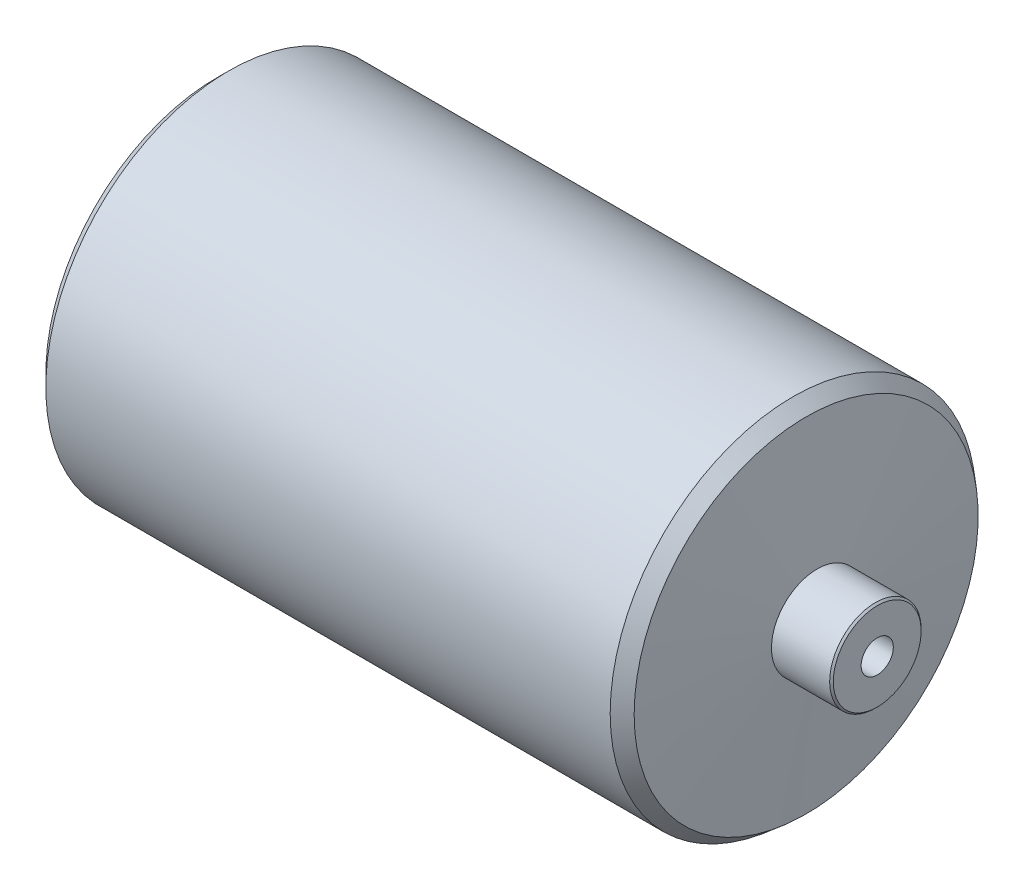
ISO-10303-21;
HEADER;
FILE_DESCRIPTION(('STEP AP214'),'2;1');
FILE_NAME('part.step','',(''),(''),'','','');
FILE_SCHEMA(('AUTOMOTIVE_DESIGN { 1 0 10303 214 1 1 1 1 }'));
ENDSEC;
DATA;
#1=APPLICATION_CONTEXT('core data for automotive mechanical design processes');
#2=APPLICATION_PROTOCOL_DEFINITION('international standard','automotive_design',2000,#1);
#3=PRODUCT_CONTEXT('',#1,'mechanical');
#4=PRODUCT('Part','Part','',(#3));
#5=PRODUCT_RELATED_PRODUCT_CATEGORY('part','',(#4));
#6=PRODUCT_DEFINITION_FORMATION('','',#4);
#7=PRODUCT_DEFINITION_CONTEXT('part definition',#1,'design');
#8=PRODUCT_DEFINITION('design','',#6,#7);
#9=PRODUCT_DEFINITION_SHAPE('','',#8);
#10=(LENGTH_UNIT() NAMED_UNIT(*) SI_UNIT(.MILLI.,.METRE.));
#11=(NAMED_UNIT(*) PLANE_ANGLE_UNIT() SI_UNIT($,.RADIAN.));
#12=(NAMED_UNIT(*) SI_UNIT($,.STERADIAN.) SOLID_ANGLE_UNIT());
#13=UNCERTAINTY_MEASURE_WITH_UNIT(LENGTH_MEASURE(1.E-05),#10,'distance_accuracy_value','');
#14=(GEOMETRIC_REPRESENTATION_CONTEXT(3) GLOBAL_UNCERTAINTY_ASSIGNED_CONTEXT((#13)) GLOBAL_UNIT_ASSIGNED_CONTEXT((#10,
#11,#12)) REPRESENTATION_CONTEXT('',''));
#15=CARTESIAN_POINT('',(0.,0.,0.));
#16=DIRECTION('',(0.,0.,1.));
#17=DIRECTION('',(1.,0.,0.));
#18=AXIS2_PLACEMENT_3D('',#15,#16,#17);
#19=CARTESIAN_POINT('',(200.,0.,0.));
#20=DIRECTION('',(-1.,0.,0.));
#21=DIRECTION('',(0.,0.,1.));
#22=AXIS2_PLACEMENT_3D('',#19,#20,#21);
#23=PLANE('',#22);
#24=CARTESIAN_POINT('',(200.,0.,0.));
#25=DIRECTION('',(1.,0.,0.));
#26=DIRECTION('',(0.,0.,-1.));
#27=AXIS2_PLACEMENT_3D('',#24,#25,#26);
#28=CIRCLE('',#27,4.4);
#29=CARTESIAN_POINT('',(200.,0.,-4.4));
#30=VERTEX_POINT('',#29);
#31=EDGE_CURVE('E63',#30,#30,#28,.T.);
#32=ORIENTED_EDGE('',*,*,#31,.F.);
#33=EDGE_LOOP('',(#32));
#34=FACE_BOUND('',#33,.T.);
#35=CARTESIAN_POINT('',(200.,0.,0.));
#36=DIRECTION('',(-1.,0.,0.));
#37=DIRECTION('',(0.,0.,1.));
#38=AXIS2_PLACEMENT_3D('',#35,#36,#37);
#39=CIRCLE('',#38,12.);
#40=CARTESIAN_POINT('',(200.,0.,12.));
#41=VERTEX_POINT('',#40);
#42=EDGE_CURVE('E83',#41,#41,#39,.F.);
#43=ORIENTED_EDGE('',*,*,#42,.T.);
#44=EDGE_LOOP('',(#43));
#45=FACE_BOUND('',#44,.T.);
#46=ADVANCED_FACE('F39',(#34,#45),#23,.F.);
#47=CARTESIAN_POINT('',(16.5,0.,0.));
#48=DIRECTION('',(-1.,0.,0.));
#49=DIRECTION('',(0.,0.,1.));
#50=AXIS2_PLACEMENT_3D('',#47,#48,#49);
#51=CYLINDRICAL_SURFACE('',#50,12.5);
#52=CARTESIAN_POINT('',(199.5,0.,0.));
#53=DIRECTION('',(-1.,0.,0.));
#54=DIRECTION('',(0.,0.,1.));
#55=AXIS2_PLACEMENT_3D('',#52,#53,#54);
#56=CIRCLE('',#55,12.5);
#57=CARTESIAN_POINT('',(199.5,0.,12.5));
#58=VERTEX_POINT('',#57);
#59=EDGE_CURVE('E80',#58,#58,#56,.T.);
#60=ORIENTED_EDGE('',*,*,#59,.T.);
#61=EDGE_LOOP('',(#60));
#62=FACE_BOUND('',#61,.T.);
#63=CARTESIAN_POINT('',(183.6,0.,0.));
#64=DIRECTION('',(1.,0.,0.));
#65=DIRECTION('',(0.,0.,-1.));
#66=AXIS2_PLACEMENT_3D('',#63,#64,#65);
#67=CIRCLE('',#66,12.5);
#68=CARTESIAN_POINT('',(183.6,0.,12.5000000000002));
#69=VERTEX_POINT('',#68);
#70=EDGE_CURVE('E74',#69,#69,#67,.T.);
#71=ORIENTED_EDGE('',*,*,#70,.T.);
#72=EDGE_LOOP('',(#71));
#73=FACE_BOUND('',#72,.T.);
#74=ADVANCED_FACE('F141',(#62,#73),#51,.T.);
#75=CARTESIAN_POINT('',(183.6,0.,0.));
#76=DIRECTION('',(-1.,0.,0.));
#77=DIRECTION('',(0.,0.,1.));
#78=AXIS2_PLACEMENT_3D('',#75,#76,#77);
#79=CONICAL_SURFACE('',#78,12.5,1.48352986419518);
#80=CARTESIAN_POINT('',(180.580642346021,0.,0.));
#81=DIRECTION('',(1.,0.,0.));
#82=DIRECTION('',(0.,0.,-1.));
#83=AXIS2_PLACEMENT_3D('',#80,#81,#82);
#84=CIRCLE('',#83,47.0114159057248);
#85=CARTESIAN_POINT('',(180.580642346021,0.,47.011415905725));
#86=VERTEX_POINT('',#85);
#87=EDGE_CURVE('E47',#86,#86,#84,.T.);
#88=CARTESIAN_POINT('',(180.580642346021,0.,47.011415905725));
#89=CARTESIAN_POINT('',(180.61209398825,0.,46.6519219900404));
#90=CARTESIAN_POINT('',(180.643545630479,0.,46.2924280743557));
#91=CARTESIAN_POINT('',(180.706448914937,0.,45.5734402429865));
#92=CARTESIAN_POINT('',(180.737900557166,0.,45.2139463273018));
#93=CARTESIAN_POINT('',(180.800803841624,0.,44.4949584959326));
#94=CARTESIAN_POINT('',(180.832255483853,0.,44.1354645802479));
#95=CARTESIAN_POINT('',(180.89515876831,0.,43.4164767488787));
#96=CARTESIAN_POINT('',(180.926610410539,0.,43.056982833194));
#97=CARTESIAN_POINT('',(180.989513694997,0.,42.3379950018248));
#98=CARTESIAN_POINT('',(181.020965337226,0.,41.9785010861401));
#99=CARTESIAN_POINT('',(181.083868621684,0.,41.2595132547709));
#100=CARTESIAN_POINT('',(181.115320263913,0.,40.9000193390862));
#101=CARTESIAN_POINT('',(181.178223548371,0.,40.181031507717));
#102=CARTESIAN_POINT('',(181.2096751906,0.,39.8215375920323));
#103=CARTESIAN_POINT('',(181.272578475058,0.,39.1025497606631));
#104=CARTESIAN_POINT('',(181.304030117287,0.,38.7430558449784));
#105=CARTESIAN_POINT('',(181.366933401745,0.,38.0240680136092));
#106=CARTESIAN_POINT('',(181.398385043974,0.,37.6645740979245));
#107=CARTESIAN_POINT('',(181.461288328432,0.,36.9455862665553));
#108=CARTESIAN_POINT('',(181.49273997066,0.,36.5860923508706));
#109=CARTESIAN_POINT('',(181.555643255118,0.,35.8671045195014));
#110=CARTESIAN_POINT('',(181.587094897347,0.,35.5076106038167));
#111=CARTESIAN_POINT('',(181.649998181805,0.,34.7886227724475));
#112=CARTESIAN_POINT('',(181.681449824034,0.,34.4291288567628));
#113=CARTESIAN_POINT('',(181.744353108492,0.,33.7101410253936));
#114=CARTESIAN_POINT('',(181.775804750721,0.,33.3506471097089));
#115=CARTESIAN_POINT('',(181.838708035179,0.,32.6316592783397));
#116=CARTESIAN_POINT('',(181.870159677408,0.,32.272165362655));
#117=CARTESIAN_POINT('',(181.933062961866,0.,31.5531775312857));
#118=CARTESIAN_POINT('',(181.964514604095,0.,31.1936836156011));
#119=CARTESIAN_POINT('',(182.027417888553,0.,30.4746957842318));
#120=CARTESIAN_POINT('',(182.058869530782,0.,30.1152018685472));
#121=CARTESIAN_POINT('',(182.121772815239,0.,29.3962140371779));
#122=CARTESIAN_POINT('',(182.153224457468,0.,29.0367201214933));
#123=CARTESIAN_POINT('',(182.216127741926,0.,28.317732290124));
#124=CARTESIAN_POINT('',(182.247579384155,0.,27.9582383744394));
#125=CARTESIAN_POINT('',(182.310482668613,0.,27.2392505430701));
#126=CARTESIAN_POINT('',(182.341934310842,0.,26.8797566273855));
#127=CARTESIAN_POINT('',(182.4048375953,0.,26.1607687960162));
#128=CARTESIAN_POINT('',(182.436289237529,0.,25.8012748803316));
#129=CARTESIAN_POINT('',(182.499192521987,0.,25.0822870489623));
#130=CARTESIAN_POINT('',(182.530644164216,0.,24.7227931332777));
#131=CARTESIAN_POINT('',(182.593547448674,0.,24.0038053019084));
#132=CARTESIAN_POINT('',(182.624999090903,0.,23.6443113862238));
#133=CARTESIAN_POINT('',(182.687902375361,0.,22.9253235548545));
#134=CARTESIAN_POINT('',(182.719354017589,0.,22.5658296391699));
#135=CARTESIAN_POINT('',(182.782257302047,0.,21.8468418078006));
#136=CARTESIAN_POINT('',(182.813708944276,0.,21.487347892116));
#137=CARTESIAN_POINT('',(182.876612228734,0.,20.7683600607467));
#138=CARTESIAN_POINT('',(182.908063870963,0.,20.4088661450621));
#139=CARTESIAN_POINT('',(182.970967155421,0.,19.6898783136928));
#140=CARTESIAN_POINT('',(183.00241879765,0.,19.3303843980082));
#141=CARTESIAN_POINT('',(183.065322082108,0.,18.6113965666389));
#142=CARTESIAN_POINT('',(183.096773724337,0.,18.2519026509543));
#143=CARTESIAN_POINT('',(183.159677008795,0.,17.532914819585));
#144=CARTESIAN_POINT('',(183.191128651024,0.,17.1734209039004));
#145=CARTESIAN_POINT('',(183.254031935482,0.,16.4544330725311));
#146=CARTESIAN_POINT('',(183.285483577711,0.,16.0949391568465));
#147=CARTESIAN_POINT('',(183.348386862168,0.,15.3759513254772));
#148=CARTESIAN_POINT('',(183.379838504397,0.,15.0164574097926));
#149=CARTESIAN_POINT('',(183.442741788855,0.,14.2974695784233));
#150=CARTESIAN_POINT('',(183.474193431084,0.,13.9379756627387));
#151=CARTESIAN_POINT('',(183.537096715542,0.,13.2189878313694));
#152=CARTESIAN_POINT('',(183.568548357771,0.,12.8594939156848));
#153=CARTESIAN_POINT('',(183.6,0.,12.5000000000002));
#154=B_SPLINE_CURVE_WITH_KNOTS('',3,(#88,#89,#90,#91,#92,#93,#94,#95,#96,#97,#98,#99,#100,#101,
#102,#103,#104,#105,#106,#107,#108,#109,#110,#111,#112,#113,#114,#115,#116,#117,#118,#119,#120,
#121,#122,#123,#124,#125,#126,#127,#128,#129,#130,#131,#132,#133,#134,#135,#136,#137,#138,#139,
#140,#141,#142,#143,#144,#145,#146,#147,#148,#149,#150,#151,#152,#153),.UNSPECIFIED.,.F.,.F.,(4,
2,2,2,2,2,2,2,2,2,2,2,2,2,2,2,2,2,2,2,2,2,2,2,2,2,2,2,2,2,2,2,4),(0.,1.08260137212112,
2.16520274424223,3.24780411636334,4.33040548848446,5.41300686060557,6.49560823272668,
7.57820960484779,8.66081097696891,9.74341234909002,10.8260137212111,11.9086150933322,
12.9912164654534,14.0738178375745,15.1564192096956,16.2390205818167,17.3216219539378,
18.4042233260589,19.48682469818,20.5694260703011,21.6520274424223,22.7346288145434,
23.8172301866645,24.8998315587856,25.9824329309067,27.0650343030278,28.1476356751489,
29.2302370472701,30.3128384193912,31.3954397915123,32.4780411636334,33.5606425357545,
34.6432439078756),.UNSPECIFIED.);
#155=EDGE_CURVE('BSEAM100',#86,#69,#154,.T.);
#156=ORIENTED_EDGE('',*,*,#87,.T.);
#157=ORIENTED_EDGE('',*,*,#70,.F.);
#158=ORIENTED_EDGE('',*,*,#155,.T.);
#159=ORIENTED_EDGE('',*,*,#155,.F.);
#160=EDGE_LOOP('',(#156,#158,#157,#159));
#161=FACE_BOUND('',#160,.T.);
#162=ADVANCED_FACE('F100',(#161),#79,.T.);
#163=CARTESIAN_POINT('',(16.5,0.,0.));
#164=DIRECTION('',(-1.,0.,0.));
#165=DIRECTION('',(0.,0.,1.));
#166=AXIS2_PLACEMENT_3D('',#163,#164,#165);
#167=CYLINDRICAL_SURFACE('',#166,50.);
#168=CARTESIAN_POINT('',(177.018986514899,0.,0.));
#169=DIRECTION('',(1.,0.,0.));
#170=DIRECTION('',(0.,0.,-1.));
#171=AXIS2_PLACEMENT_3D('',#168,#169,#170);
#172=CIRCLE('',#171,50.);
#173=CARTESIAN_POINT('',(177.018986514899,0.,-50.));
#174=VERTEX_POINT('',#173);
#175=EDGE_CURVE('E95',#174,#174,#172,.F.);
#176=ORIENTED_EDGE('',*,*,#175,.T.);
#177=EDGE_LOOP('',(#176));
#178=FACE_BOUND('',#177,.T.);
#179=CARTESIAN_POINT('',(22.780824882222,0.,0.));
#180=DIRECTION('',(1.,0.,0.));
#181=DIRECTION('',(0.,0.,-1.));
#182=AXIS2_PLACEMENT_3D('',#179,#180,#181);
#183=CIRCLE('',#182,50.);
#184=CARTESIAN_POINT('',(22.780824882222,0.,-50.));
#185=VERTEX_POINT('',#184);
#186=EDGE_CURVE('E92',#185,#185,#183,.T.);
#187=ORIENTED_EDGE('',*,*,#186,.T.);
#188=EDGE_LOOP('',(#187));
#189=FACE_BOUND('',#188,.T.);
#190=ADVANCED_FACE('F109',(#178,#189),#167,.T.);
#191=CARTESIAN_POINT('',(16.5,0.,0.));
#192=DIRECTION('',(1.,0.,0.));
#193=DIRECTION('',(0.,0.,-1.));
#194=AXIS2_PLACEMENT_3D('',#191,#192,#193);
#195=CONICAL_SURFACE('',#194,12.5,1.48352986419518);
#196=CARTESIAN_POINT('',(19.4931944933306,0.,0.));
#197=DIRECTION('',(1.,0.,0.));
#198=DIRECTION('',(0.,0.,-1.));
#199=AXIS2_PLACEMENT_3D('',#196,#197,#198);
#200=CIRCLE('',#199,46.7123696111087);
#201=CARTESIAN_POINT('',(19.4931944933306,0.,-46.712369611108));
#202=VERTEX_POINT('',#201);
#203=EDGE_CURVE('E11',#202,#202,#200,.F.);
#204=CARTESIAN_POINT('',(16.5,0.,0.));
#205=DIRECTION('',(1.,0.,0.));
#206=DIRECTION('',(0.,0.,-1.));
#207=AXIS2_PLACEMENT_3D('',#204,#205,#206);
#208=CIRCLE('',#207,12.5);
#209=CARTESIAN_POINT('',(16.5,0.,-12.5));
#210=VERTEX_POINT('',#209);
#211=EDGE_CURVE('E77',#210,#210,#208,.T.);
#212=CARTESIAN_POINT('',(19.4931944933306,0.,-46.712369611108));
#213=CARTESIAN_POINT('',(19.4620153840251,0.,-46.3559907609923));
#214=CARTESIAN_POINT('',(19.4308362747196,0.,-45.9996119108766));
#215=CARTESIAN_POINT('',(19.3684780561085,0.,-45.2868542106452));
#216=CARTESIAN_POINT('',(19.337298946803,0.,-44.9304753605295));
#217=CARTESIAN_POINT('',(19.274940728192,0.,-44.217717660298));
#218=CARTESIAN_POINT('',(19.2437616188864,0.,-43.8613388101823));
#219=CARTESIAN_POINT('',(19.1814034002754,0.,-43.1485811099509));
#220=CARTESIAN_POINT('',(19.1502242909698,0.,-42.7922022598352));
#221=CARTESIAN_POINT('',(19.0878660723588,0.,-42.0794445596038));
#222=CARTESIAN_POINT('',(19.0566869630533,0.,-41.7230657094881));
#223=CARTESIAN_POINT('',(18.9943287444422,0.,-41.0103080092567));
#224=CARTESIAN_POINT('',(18.9631496351367,0.,-40.653929159141));
#225=CARTESIAN_POINT('',(18.9007914165256,0.,-39.9411714589095));
#226=CARTESIAN_POINT('',(18.8696123072201,0.,-39.5847926087938));
#227=CARTESIAN_POINT('',(18.807254088609,0.,-38.8720349085624));
#228=CARTESIAN_POINT('',(18.7760749793035,0.,-38.5156560584467));
#229=CARTESIAN_POINT('',(18.7137167606925,0.,-37.8028983582153));
#230=CARTESIAN_POINT('',(18.6825376513869,0.,-37.4465195080996));
#231=CARTESIAN_POINT('',(18.6201794327759,0.,-36.7337618078682));
#232=CARTESIAN_POINT('',(18.5890003234703,0.,-36.3773829577525));
#233=CARTESIAN_POINT('',(18.5266421048593,0.,-35.664625257521));
#234=CARTESIAN_POINT('',(18.4954629955538,0.,-35.3082464074053));
#235=CARTESIAN_POINT('',(18.4331047769427,0.,-34.5954887071739));
#236=CARTESIAN_POINT('',(18.4019256676372,0.,-34.2391098570582));
#237=CARTESIAN_POINT('',(18.3395674490261,0.,-33.5263521568268));
#238=CARTESIAN_POINT('',(18.3083883397206,0.,-33.1699733067111));
#239=CARTESIAN_POINT('',(18.2460301211095,0.,-32.4572156064797));
#240=CARTESIAN_POINT('',(18.214851011804,0.,-32.1008367563639));
#241=CARTESIAN_POINT('',(18.152492793193,0.,-31.3880790561325));
#242=CARTESIAN_POINT('',(18.1213136838874,0.,-31.0317002060168));
#243=CARTESIAN_POINT('',(18.0589554652764,0.,-30.3189425057854));
#244=CARTESIAN_POINT('',(18.0277763559709,0.,-29.9625636556697));
#245=CARTESIAN_POINT('',(17.9654181373598,0.,-29.2498059554383));
#246=CARTESIAN_POINT('',(17.9342390280543,0.,-28.8934271053226));
#247=CARTESIAN_POINT('',(17.8718808094432,0.,-28.1806694050912));
#248=CARTESIAN_POINT('',(17.8407017001377,0.,-27.8242905549754));
#249=CARTESIAN_POINT('',(17.7783434815266,0.,-27.111532854744));
#250=CARTESIAN_POINT('',(17.7471643722211,0.,-26.7551540046283));
#251=CARTESIAN_POINT('',(17.68480615361,0.,-26.0423963043969));
#252=CARTESIAN_POINT('',(17.6536270443045,0.,-25.6860174542812));
#253=CARTESIAN_POINT('',(17.5912688256935,0.,-24.9732597540498));
#254=CARTESIAN_POINT('',(17.5600897163879,0.,-24.6168809039341));
#255=CARTESIAN_POINT('',(17.4977314977769,0.,-23.9041232037027));
#256=CARTESIAN_POINT('',(17.4665523884714,0.,-23.5477443535869));
#257=CARTESIAN_POINT('',(17.4041941698603,0.,-22.8349866533555));
#258=CARTESIAN_POINT('',(17.3730150605548,0.,-22.4786078032398));
#259=CARTESIAN_POINT('',(17.3106568419437,0.,-21.7658501030084));
#260=CARTESIAN_POINT('',(17.2794777326382,0.,-21.4094712528927));
#261=CARTESIAN_POINT('',(17.2171195140271,0.,-20.6967135526613));
#262=CARTESIAN_POINT('',(17.1859404047216,0.,-20.3403347025456));
#263=CARTESIAN_POINT('',(17.1235821861105,0.,-19.6275770023142));
#264=CARTESIAN_POINT('',(17.092403076805,0.,-19.2711981521984));
#265=CARTESIAN_POINT('',(17.030044858194,0.,-18.558440451967));
#266=CARTESIAN_POINT('',(16.9988657488884,0.,-18.2020616018513));
#267=CARTESIAN_POINT('',(16.9365075302774,0.,-17.4893039016199));
#268=CARTESIAN_POINT('',(16.9053284209719,0.,-17.1329250515042));
#269=CARTESIAN_POINT('',(16.8429702023608,0.,-16.4201673512728));
#270=CARTESIAN_POINT('',(16.8117910930553,0.,-16.0637885011571));
#271=CARTESIAN_POINT('',(16.7494328744442,0.,-15.3510308009256));
#272=CARTESIAN_POINT('',(16.7182537651387,0.,-14.9946519508099));
#273=CARTESIAN_POINT('',(16.6558955465276,0.,-14.2818942505785));
#274=CARTESIAN_POINT('',(16.6247164372221,0.,-13.9255154004628));
#275=CARTESIAN_POINT('',(16.5623582186111,0.,-13.2127577002314));
#276=CARTESIAN_POINT('',(16.5311791093055,0.,-12.8563788501157));
#277=CARTESIAN_POINT('',(16.5,0.,-12.5));
#278=B_SPLINE_CURVE_WITH_KNOTS('',3,(#212,#213,#214,#215,#216,#217,#218,#219,#220,#221,#222,
#223,#224,#225,#226,#227,#228,#229,#230,#231,#232,#233,#234,#235,#236,#237,#238,#239,#240,#241,
#242,#243,#244,#245,#246,#247,#248,#249,#250,#251,#252,#253,#254,#255,#256,#257,#258,#259,#260,
#261,#262,#263,#264,#265,#266,#267,#268,#269,#270,#271,#272,#273,#274,#275,#276,#277),
.UNSPECIFIED.,.F.,.F.,(4,2,2,2,2,2,2,2,2,2,2,2,2,2,2,2,2,2,2,2,2,2,2,2,2,2,2,2,2,2,2,2,4),(0.,
1.07322047828109,2.1464409565622,3.21966143484331,4.29288191312442,5.36610239140553,
6.43932286968663,7.51254334796773,8.58576382624884,9.65898430452994,10.732204782811,
11.8054252610922,12.8786457393733,13.9518662176544,15.0250866959355,16.0983071742166,
17.1715276524977,18.2447481307788,19.3179686090599,20.391189087341,21.4644095656221,
22.5376300439032,23.6108505221843,24.6840710004654,25.7572914787465,26.8305119570276,
27.9037324353088,28.9769529135899,30.050173391871,31.1233938701521,32.1966143484332,
33.2698348267143,34.3430553049954),.UNSPECIFIED.);
#279=EDGE_CURVE('BSEAM112',#202,#210,#278,.T.);
#280=ORIENTED_EDGE('',*,*,#203,.T.);
#281=ORIENTED_EDGE('',*,*,#211,.T.);
#282=ORIENTED_EDGE('',*,*,#279,.T.);
#283=ORIENTED_EDGE('',*,*,#279,.F.);
#284=EDGE_LOOP('',(#280,#282,#281,#283));
#285=FACE_BOUND('',#284,.T.);
#286=ADVANCED_FACE('F112',(#285),#195,.T.);
#287=CARTESIAN_POINT('',(0.,0.,0.));
#288=DIRECTION('',(-1.,0.,0.));
#289=DIRECTION('',(0.,0.,1.));
#290=AXIS2_PLACEMENT_3D('',#287,#288,#289);
#291=PLANE('',#290);
#292=CARTESIAN_POINT('',(0.,0.,0.));
#293=DIRECTION('',(-1.,0.,0.));
#294=DIRECTION('',(0.,0.,1.));
#295=AXIS2_PLACEMENT_3D('',#292,#293,#294);
#296=CIRCLE('',#295,4.39999999999999);
#297=CARTESIAN_POINT('',(0.,0.,4.39999999999999));
#298=VERTEX_POINT('',#297);
#299=EDGE_CURVE('E64',#298,#298,#296,.T.);
#300=ORIENTED_EDGE('',*,*,#299,.F.);
#301=EDGE_LOOP('',(#300));
#302=FACE_BOUND('',#301,.T.);
#303=CARTESIAN_POINT('',(0.,0.,0.));
#304=DIRECTION('',(-1.,0.,0.));
#305=DIRECTION('',(0.,0.,1.));
#306=AXIS2_PLACEMENT_3D('',#303,#304,#305);
#307=CIRCLE('',#306,12.);
#308=CARTESIAN_POINT('',(0.,0.,12.));
#309=VERTEX_POINT('',#308);
#310=EDGE_CURVE('E86',#309,#309,#307,.T.);
#311=ORIENTED_EDGE('',*,*,#310,.T.);
#312=EDGE_LOOP('',(#311));
#313=FACE_BOUND('',#312,.T.);
#314=ADVANCED_FACE('F123',(#302,#313),#291,.T.);
#315=CARTESIAN_POINT('',(16.5,0.,0.));
#316=DIRECTION('',(-1.,0.,0.));
#317=DIRECTION('',(0.,0.,1.));
#318=AXIS2_PLACEMENT_3D('',#315,#316,#317);
#319=CYLINDRICAL_SURFACE('',#318,12.5);
#320=CARTESIAN_POINT('',(0.500000000000007,0.,0.));
#321=DIRECTION('',(-1.,0.,0.));
#322=DIRECTION('',(0.,0.,1.));
#323=AXIS2_PLACEMENT_3D('',#320,#321,#322);
#324=CIRCLE('',#323,12.5);
#325=CARTESIAN_POINT('',(0.500000000000007,0.,12.5));
#326=VERTEX_POINT('',#325);
#327=EDGE_CURVE('E89',#326,#326,#324,.F.);
#328=ORIENTED_EDGE('',*,*,#327,.T.);
#329=EDGE_LOOP('',(#328));
#330=FACE_BOUND('',#329,.T.);
#331=ORIENTED_EDGE('',*,*,#211,.F.);
#332=EDGE_LOOP('',(#331));
#333=FACE_BOUND('',#332,.T.);
#334=ADVANCED_FACE('F127',(#330,#333),#319,.T.);
#335=CARTESIAN_POINT('',(199.5,0.,0.));
#336=DIRECTION('',(-1.,0.,0.));
#337=DIRECTION('',(0.,0.,1.));
#338=AXIS2_PLACEMENT_3D('',#335,#336,#337);
#339=CONICAL_SURFACE('',#338,12.5,0.785398163397466);
#340=ORIENTED_EDGE('',*,*,#42,.F.);
#341=EDGE_LOOP('',(#340));
#342=FACE_BOUND('',#341,.T.);
#343=ORIENTED_EDGE('',*,*,#59,.F.);
#344=EDGE_LOOP('',(#343));
#345=FACE_BOUND('',#344,.T.);
#346=ADVANCED_FACE('F129',(#342,#345),#339,.T.);
#347=CARTESIAN_POINT('',(0.,0.,0.));
#348=DIRECTION('',(1.,0.,0.));
#349=DIRECTION('',(0.,0.,-1.));
#350=AXIS2_PLACEMENT_3D('',#347,#348,#349);
#351=CONICAL_SURFACE('',#350,12.,0.785398163397459);
#352=ORIENTED_EDGE('',*,*,#327,.F.);
#353=EDGE_LOOP('',(#352));
#354=FACE_BOUND('',#353,.T.);
#355=ORIENTED_EDGE('',*,*,#310,.F.);
#356=EDGE_LOOP('',(#355));
#357=FACE_BOUND('',#356,.T.);
#358=ADVANCED_FACE('F106',(#354,#357),#351,.T.);
#359=CARTESIAN_POINT('',(177.018986514899,0.,0.));
#360=DIRECTION('',(-1.,0.,0.));
#361=DIRECTION('',(0.,0.,1.));
#362=AXIS2_PLACEMENT_3D('',#359,#360,#361);
#363=CONICAL_SURFACE('',#362,50.,0.698131700797736);
#364=ORIENTED_EDGE('',*,*,#87,.F.);
#365=EDGE_LOOP('',(#364));
#366=FACE_BOUND('',#365,.T.);
#367=ORIENTED_EDGE('',*,*,#175,.F.);
#368=EDGE_LOOP('',(#367));
#369=FACE_BOUND('',#368,.T.);
#370=ADVANCED_FACE('F103',(#366,#369),#363,.T.);
#371=CARTESIAN_POINT('',(19.4931944933307,0.,0.));
#372=DIRECTION('',(1.,0.,0.));
#373=DIRECTION('',(0.,0.,-1.));
#374=AXIS2_PLACEMENT_3D('',#371,#372,#373);
#375=CONICAL_SURFACE('',#374,46.7123696111087,0.785398163397443);
#376=ORIENTED_EDGE('',*,*,#186,.F.);
#377=EDGE_LOOP('',(#376));
#378=FACE_BOUND('',#377,.T.);
#379=ORIENTED_EDGE('',*,*,#203,.F.);
#380=EDGE_LOOP('',(#379));
#381=FACE_BOUND('',#380,.T.);
#382=ADVANCED_FACE('F41',(#378,#381),#375,.T.);
#383=CARTESIAN_POINT('',(141.,0.,0.));
#384=DIRECTION('',(1.,0.,0.));
#385=DIRECTION('',(0.,0.,-1.));
#386=AXIS2_PLACEMENT_3D('',#383,#384,#385);
#387=CONICAL_SURFACE('',#386,4.39999999999999,1.02974425867665);
#388=CARTESIAN_POINT('',(138.356213276279,0.,0.));
#389=VERTEX_POINT('',#388);
#390=VERTEX_LOOP('',#389);
#391=FACE_BOUND('',#390,.T.);
#392=CARTESIAN_POINT('',(141.,0.,0.));
#393=DIRECTION('',(1.,0.,0.));
#394=DIRECTION('',(0.,0.,-1.));
#395=AXIS2_PLACEMENT_3D('',#392,#393,#394);
#396=CIRCLE('',#395,4.39999999999999);
#397=CARTESIAN_POINT('',(141.,0.,-4.39999999999999));
#398=VERTEX_POINT('',#397);
#399=EDGE_CURVE('E67',#398,#398,#396,.T.);
#400=ORIENTED_EDGE('',*,*,#399,.T.);
#401=EDGE_LOOP('',(#400));
#402=FACE_BOUND('',#401,.T.);
#403=ADVANCED_FACE('F118',(#391,#402),#387,.F.);
#404=CARTESIAN_POINT('',(200.,0.,0.));
#405=DIRECTION('',(1.,0.,0.));
#406=DIRECTION('',(0.,0.,-1.));
#407=AXIS2_PLACEMENT_3D('',#404,#405,#406);
#408=CYLINDRICAL_SURFACE('',#407,4.39999999999999);
#409=ORIENTED_EDGE('',*,*,#399,.F.);
#410=EDGE_LOOP('',(#409));
#411=FACE_BOUND('',#410,.T.);
#412=ORIENTED_EDGE('',*,*,#31,.T.);
#413=EDGE_LOOP('',(#412));
#414=FACE_BOUND('',#413,.T.);
#415=ADVANCED_FACE('F57',(#411,#414),#408,.F.);
#416=CARTESIAN_POINT('',(59.,0.,0.));
#417=DIRECTION('',(-1.,0.,0.));
#418=DIRECTION('',(0.,0.,1.));
#419=AXIS2_PLACEMENT_3D('',#416,#417,#418);
#420=CONICAL_SURFACE('',#419,4.39999999999998,1.02974425867665);
#421=CARTESIAN_POINT('',(61.6437867237213,0.,0.));
#422=VERTEX_POINT('',#421);
#423=VERTEX_LOOP('',#422);
#424=FACE_BOUND('',#423,.T.);
#425=CARTESIAN_POINT('',(59.,0.,0.));
#426=DIRECTION('',(-1.,0.,0.));
#427=DIRECTION('',(0.,0.,1.));
#428=AXIS2_PLACEMENT_3D('',#425,#426,#427);
#429=CIRCLE('',#428,4.39999999999998);
#430=CARTESIAN_POINT('',(59.,0.,4.39999999999998));
#431=VERTEX_POINT('',#430);
#432=EDGE_CURVE('E61',#431,#431,#429,.T.);
#433=ORIENTED_EDGE('',*,*,#432,.T.);
#434=EDGE_LOOP('',(#433));
#435=FACE_BOUND('',#434,.T.);
#436=ADVANCED_FACE('F53',(#424,#435),#420,.F.);
#437=CARTESIAN_POINT('',(0.,0.,0.));
#438=DIRECTION('',(-1.,0.,0.));
#439=DIRECTION('',(0.,0.,1.));
#440=AXIS2_PLACEMENT_3D('',#437,#438,#439);
#441=CYLINDRICAL_SURFACE('',#440,4.39999999999998);
#442=ORIENTED_EDGE('',*,*,#432,.F.);
#443=EDGE_LOOP('',(#442));
#444=FACE_BOUND('',#443,.T.);
#445=ORIENTED_EDGE('',*,*,#299,.T.);
#446=EDGE_LOOP('',(#445));
#447=FACE_BOUND('',#446,.T.);
#448=ADVANCED_FACE('F56',(#444,#447),#441,.F.);
#449=CLOSED_SHELL('',(#46,#74,#162,#190,#286,#314,#334,#346,#358,#370,#382,#403,#415,#436,#448));
#450=MANIFOLD_SOLID_BREP('B2',#449);
#451=ADVANCED_BREP_SHAPE_REPRESENTATION('',(#18,#450),#14);
#452=SHAPE_DEFINITION_REPRESENTATION(#9,#451);
ENDSEC;
END-ISO-10303-21;
